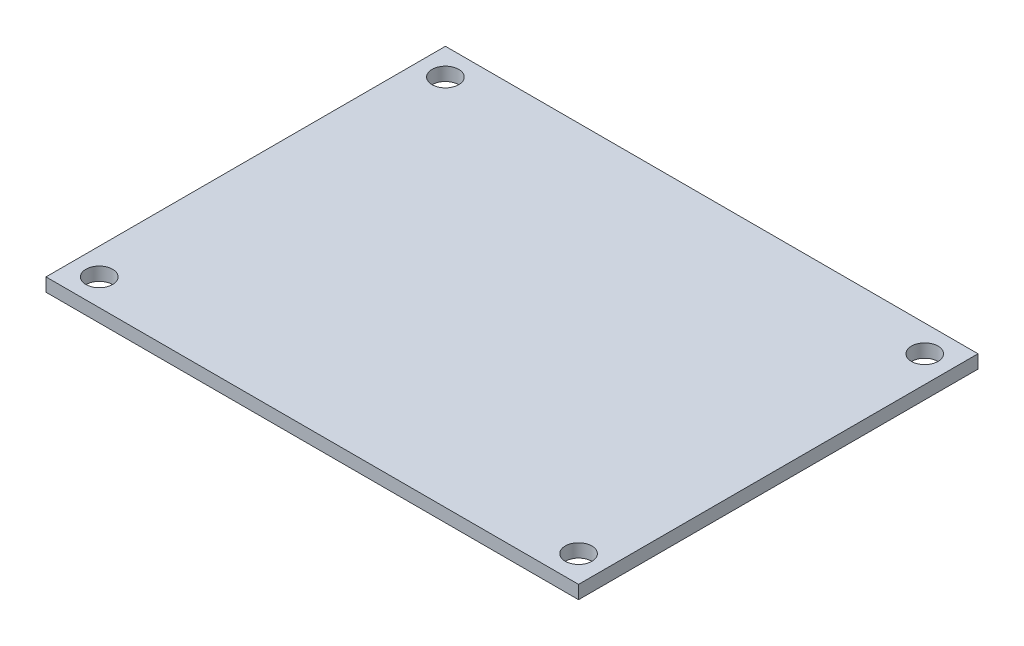
ISO-10303-21;
HEADER;
FILE_DESCRIPTION(('STEP AP214'),'2;1');
FILE_NAME('part.step','',(''),(''),'','','');
FILE_SCHEMA(('AUTOMOTIVE_DESIGN { 1 0 10303 214 1 1 1 1 }'));
ENDSEC;
DATA;
#1=APPLICATION_CONTEXT('core data for automotive mechanical design processes');
#2=APPLICATION_PROTOCOL_DEFINITION('international standard','automotive_design',2000,#1);
#3=PRODUCT_CONTEXT('',#1,'mechanical');
#4=PRODUCT('Part','Part','',(#3));
#5=PRODUCT_RELATED_PRODUCT_CATEGORY('part','',(#4));
#6=PRODUCT_DEFINITION_FORMATION('','',#4);
#7=PRODUCT_DEFINITION_CONTEXT('part definition',#1,'design');
#8=PRODUCT_DEFINITION('design','',#6,#7);
#9=PRODUCT_DEFINITION_SHAPE('','',#8);
#10=(LENGTH_UNIT() NAMED_UNIT(*) SI_UNIT(.MILLI.,.METRE.));
#11=(NAMED_UNIT(*) PLANE_ANGLE_UNIT() SI_UNIT($,.RADIAN.));
#12=(NAMED_UNIT(*) SI_UNIT($,.STERADIAN.) SOLID_ANGLE_UNIT());
#13=UNCERTAINTY_MEASURE_WITH_UNIT(LENGTH_MEASURE(1.E-05),#10,'distance_accuracy_value','');
#14=(GEOMETRIC_REPRESENTATION_CONTEXT(3) GLOBAL_UNCERTAINTY_ASSIGNED_CONTEXT((#13)) GLOBAL_UNIT_ASSIGNED_CONTEXT((#10,
#11,#12)) REPRESENTATION_CONTEXT('',''));
#15=CARTESIAN_POINT('',(0.,0.,0.));
#16=DIRECTION('',(0.,0.,1.));
#17=DIRECTION('',(1.,0.,0.));
#18=AXIS2_PLACEMENT_3D('',#15,#16,#17);
#19=CARTESIAN_POINT('',(30.,-0.75,-45.));
#20=DIRECTION('',(0.,0.,1.));
#21=DIRECTION('',(1.,0.,0.));
#22=AXIS2_PLACEMENT_3D('',#19,#20,#21);
#23=PLANE('',#22);
#24=DIRECTION('',(0.,1.,0.));
#25=VECTOR('',#24,1.);
#26=CARTESIAN_POINT('',(0.,-0.75,-45.));
#27=LINE('',#26,#25);
#28=CARTESIAN_POINT('',(0.,-1.5,-45.));
#29=VERTEX_POINT('',#28);
#30=CARTESIAN_POINT('',(0.,0.,-45.));
#31=VERTEX_POINT('',#30);
#32=EDGE_CURVE('E177',#29,#31,#27,.T.);
#33=ORIENTED_EDGE('',*,*,#32,.T.);
#34=DIRECTION('',(-1.,0.,0.));
#35=VECTOR('',#34,1.);
#36=CARTESIAN_POINT('',(30.,0.,-45.));
#37=LINE('',#36,#35);
#38=CARTESIAN_POINT('',(60.,0.,-45.));
#39=VERTEX_POINT('',#38);
#40=EDGE_CURVE('E142',#39,#31,#37,.T.);
#41=ORIENTED_EDGE('',*,*,#40,.F.);
#42=DIRECTION('',(0.,1.,0.));
#43=VECTOR('',#42,1.);
#44=CARTESIAN_POINT('',(60.,-0.75,-45.));
#45=LINE('',#44,#43);
#46=CARTESIAN_POINT('',(60.,-1.5,-45.));
#47=VERTEX_POINT('',#46);
#48=EDGE_CURVE('E11',#47,#39,#45,.T.);
#49=ORIENTED_EDGE('',*,*,#48,.F.);
#50=DIRECTION('',(1.,0.,0.));
#51=VECTOR('',#50,1.);
#52=CARTESIAN_POINT('',(30.,-1.5,-45.));
#53=LINE('',#52,#51);
#54=EDGE_CURVE('E130',#29,#47,#53,.T.);
#55=ORIENTED_EDGE('',*,*,#54,.F.);
#56=EDGE_LOOP('',(#33,#41,#49,#55));
#57=FACE_BOUND('',#56,.T.);
#58=ADVANCED_FACE('F16',(#57),#23,.F.);
#59=CARTESIAN_POINT('',(60.,-0.75,-22.5));
#60=DIRECTION('',(-1.,0.,0.));
#61=DIRECTION('',(0.,0.,1.));
#62=AXIS2_PLACEMENT_3D('',#59,#60,#61);
#63=PLANE('',#62);
#64=ORIENTED_EDGE('',*,*,#48,.T.);
#65=DIRECTION('',(0.,0.,-1.));
#66=VECTOR('',#65,1.);
#67=CARTESIAN_POINT('',(60.,0.,-22.5));
#68=LINE('',#67,#66);
#69=CARTESIAN_POINT('',(60.,0.,0.));
#70=VERTEX_POINT('',#69);
#71=EDGE_CURVE('E188',#70,#39,#68,.T.);
#72=ORIENTED_EDGE('',*,*,#71,.F.);
#73=DIRECTION('',(0.,1.,0.));
#74=VECTOR('',#73,1.);
#75=CARTESIAN_POINT('',(60.,-0.75,0.));
#76=LINE('',#75,#74);
#77=CARTESIAN_POINT('',(60.,-1.5,0.));
#78=VERTEX_POINT('',#77);
#79=EDGE_CURVE('E27',#78,#70,#76,.T.);
#80=ORIENTED_EDGE('',*,*,#79,.F.);
#81=DIRECTION('',(0.,0.,1.));
#82=VECTOR('',#81,1.);
#83=CARTESIAN_POINT('',(60.,-1.5,-22.5));
#84=LINE('',#83,#82);
#85=EDGE_CURVE('E167',#47,#78,#84,.T.);
#86=ORIENTED_EDGE('',*,*,#85,.F.);
#87=EDGE_LOOP('',(#64,#72,#80,#86));
#88=FACE_BOUND('',#87,.T.);
#89=ADVANCED_FACE('F18',(#88),#63,.F.);
#90=CARTESIAN_POINT('',(30.,-0.75,0.));
#91=DIRECTION('',(0.,0.,-1.));
#92=DIRECTION('',(0.,-1.,0.));
#93=AXIS2_PLACEMENT_3D('',#90,#91,#92);
#94=PLANE('',#93);
#95=ORIENTED_EDGE('',*,*,#79,.T.);
#96=DIRECTION('',(1.,0.,0.));
#97=VECTOR('',#96,1.);
#98=CARTESIAN_POINT('',(30.,0.,0.));
#99=LINE('',#98,#97);
#100=CARTESIAN_POINT('',(0.,0.,0.));
#101=VERTEX_POINT('',#100);
#102=EDGE_CURVE('E141',#101,#70,#99,.T.);
#103=ORIENTED_EDGE('',*,*,#102,.F.);
#104=DIRECTION('',(0.,1.,0.));
#105=VECTOR('',#104,1.);
#106=CARTESIAN_POINT('',(0.,-0.75,0.));
#107=LINE('',#106,#105);
#108=CARTESIAN_POINT('',(0.,-1.5,0.));
#109=VERTEX_POINT('',#108);
#110=EDGE_CURVE('E165',#109,#101,#107,.T.);
#111=ORIENTED_EDGE('',*,*,#110,.F.);
#112=DIRECTION('',(-1.,0.,0.));
#113=VECTOR('',#112,1.);
#114=CARTESIAN_POINT('',(30.,-1.5,0.));
#115=LINE('',#114,#113);
#116=EDGE_CURVE('E171',#78,#109,#115,.T.);
#117=ORIENTED_EDGE('',*,*,#116,.F.);
#118=EDGE_LOOP('',(#95,#103,#111,#117));
#119=FACE_BOUND('',#118,.T.);
#120=ADVANCED_FACE('F297',(#119),#94,.F.);
#121=CARTESIAN_POINT('',(0.,-0.75,-22.5));
#122=DIRECTION('',(1.,0.,0.));
#123=DIRECTION('',(0.,1.,0.));
#124=AXIS2_PLACEMENT_3D('',#121,#122,#123);
#125=PLANE('',#124);
#126=ORIENTED_EDGE('',*,*,#110,.T.);
#127=DIRECTION('',(0.,0.,1.));
#128=VECTOR('',#127,1.);
#129=CARTESIAN_POINT('',(0.,0.,-22.5));
#130=LINE('',#129,#128);
#131=EDGE_CURVE('E137',#31,#101,#130,.T.);
#132=ORIENTED_EDGE('',*,*,#131,.F.);
#133=ORIENTED_EDGE('',*,*,#32,.F.);
#134=DIRECTION('',(0.,0.,-1.));
#135=VECTOR('',#134,1.);
#136=CARTESIAN_POINT('',(0.,-1.5,-22.5));
#137=LINE('',#136,#135);
#138=EDGE_CURVE('E20',#109,#29,#137,.T.);
#139=ORIENTED_EDGE('',*,*,#138,.F.);
#140=EDGE_LOOP('',(#126,#132,#133,#139));
#141=FACE_BOUND('',#140,.T.);
#142=ADVANCED_FACE('F288',(#141),#125,.F.);
#143=CARTESIAN_POINT('',(30.,0.,-22.5));
#144=DIRECTION('',(0.,-1.,0.));
#145=DIRECTION('',(0.,0.,-1.));
#146=AXIS2_PLACEMENT_3D('',#143,#144,#145);
#147=PLANE('',#146);
#148=CARTESIAN_POINT('',(57.,0.,-3.));
#149=DIRECTION('',(0.,-1.,0.));
#150=DIRECTION('',(1.,0.,0.));
#151=AXIS2_PLACEMENT_3D('',#148,#149,#150);
#152=CIRCLE('',#151,1.5);
#153=CARTESIAN_POINT('',(55.5,0.,-3.));
#154=VERTEX_POINT('',#153);
#155=EDGE_CURVE('E110',#154,#154,#152,.T.);
#156=ORIENTED_EDGE('',*,*,#155,.T.);
#157=EDGE_LOOP('',(#156));
#158=FACE_BOUND('',#157,.T.);
#159=CARTESIAN_POINT('',(57.,0.,-42.));
#160=DIRECTION('',(0.,-1.,0.));
#161=DIRECTION('',(-1.,0.,0.));
#162=AXIS2_PLACEMENT_3D('',#159,#160,#161);
#163=CIRCLE('',#162,1.5);
#164=CARTESIAN_POINT('',(58.5,0.,-42.));
#165=VERTEX_POINT('',#164);
#166=EDGE_CURVE('E99',#165,#165,#163,.T.);
#167=ORIENTED_EDGE('',*,*,#166,.T.);
#168=EDGE_LOOP('',(#167));
#169=FACE_BOUND('',#168,.T.);
#170=CARTESIAN_POINT('',(3.,0.,-42.));
#171=DIRECTION('',(0.,-1.,0.));
#172=DIRECTION('',(-1.,0.,0.));
#173=AXIS2_PLACEMENT_3D('',#170,#171,#172);
#174=CIRCLE('',#173,1.5);
#175=CARTESIAN_POINT('',(4.5,0.,-42.));
#176=VERTEX_POINT('',#175);
#177=EDGE_CURVE('E181',#176,#176,#174,.T.);
#178=ORIENTED_EDGE('',*,*,#177,.T.);
#179=EDGE_LOOP('',(#178));
#180=FACE_BOUND('',#179,.T.);
#181=CARTESIAN_POINT('',(3.,0.,-3.));
#182=DIRECTION('',(0.,-1.,0.));
#183=DIRECTION('',(1.,0.,0.));
#184=AXIS2_PLACEMENT_3D('',#181,#182,#183);
#185=CIRCLE('',#184,1.5);
#186=CARTESIAN_POINT('',(1.5,0.,-3.));
#187=VERTEX_POINT('',#186);
#188=EDGE_CURVE('E136',#187,#187,#185,.T.);
#189=ORIENTED_EDGE('',*,*,#188,.T.);
#190=EDGE_LOOP('',(#189));
#191=FACE_BOUND('',#190,.T.);
#192=ORIENTED_EDGE('',*,*,#40,.T.);
#193=ORIENTED_EDGE('',*,*,#131,.T.);
#194=ORIENTED_EDGE('',*,*,#102,.T.);
#195=ORIENTED_EDGE('',*,*,#71,.T.);
#196=EDGE_LOOP('',(#192,#193,#194,#195));
#197=FACE_BOUND('',#196,.T.);
#198=ADVANCED_FACE('F279',(#158,#169,#180,#191,#197),#147,.F.);
#199=CARTESIAN_POINT('',(30.,-1.5,-22.5));
#200=DIRECTION('',(0.,-1.,0.));
#201=DIRECTION('',(0.,0.,-1.));
#202=AXIS2_PLACEMENT_3D('',#199,#200,#201);
#203=PLANE('',#202);
#204=CARTESIAN_POINT('',(57.,-1.5,-3.));
#205=DIRECTION('',(0.,1.,0.));
#206=DIRECTION('',(1.,0.,0.));
#207=AXIS2_PLACEMENT_3D('',#204,#205,#206);
#208=CIRCLE('',#207,1.5);
#209=CARTESIAN_POINT('',(55.5,-1.5,-3.));
#210=VERTEX_POINT('',#209);
#211=EDGE_CURVE('E109',#210,#210,#208,.T.);
#212=ORIENTED_EDGE('',*,*,#211,.T.);
#213=EDGE_LOOP('',(#212));
#214=FACE_BOUND('',#213,.T.);
#215=CARTESIAN_POINT('',(57.,-1.5,-42.));
#216=DIRECTION('',(0.,1.,0.));
#217=DIRECTION('',(-1.,0.,0.));
#218=AXIS2_PLACEMENT_3D('',#215,#216,#217);
#219=CIRCLE('',#218,1.5);
#220=CARTESIAN_POINT('',(58.5,-1.5,-42.));
#221=VERTEX_POINT('',#220);
#222=EDGE_CURVE('E126',#221,#221,#219,.T.);
#223=ORIENTED_EDGE('',*,*,#222,.T.);
#224=EDGE_LOOP('',(#223));
#225=FACE_BOUND('',#224,.T.);
#226=CARTESIAN_POINT('',(3.,-1.5,-42.));
#227=DIRECTION('',(0.,1.,0.));
#228=DIRECTION('',(-1.,0.,0.));
#229=AXIS2_PLACEMENT_3D('',#226,#227,#228);
#230=CIRCLE('',#229,1.5);
#231=CARTESIAN_POINT('',(4.5,-1.5,-42.));
#232=VERTEX_POINT('',#231);
#233=EDGE_CURVE('E131',#232,#232,#230,.T.);
#234=ORIENTED_EDGE('',*,*,#233,.T.);
#235=EDGE_LOOP('',(#234));
#236=FACE_BOUND('',#235,.T.);
#237=CARTESIAN_POINT('',(3.,-1.5,-3.));
#238=DIRECTION('',(0.,1.,0.));
#239=DIRECTION('',(1.,0.,0.));
#240=AXIS2_PLACEMENT_3D('',#237,#238,#239);
#241=CIRCLE('',#240,1.5);
#242=CARTESIAN_POINT('',(1.5,-1.5,-3.));
#243=VERTEX_POINT('',#242);
#244=EDGE_CURVE('E154',#243,#243,#241,.T.);
#245=ORIENTED_EDGE('',*,*,#244,.T.);
#246=EDGE_LOOP('',(#245));
#247=FACE_BOUND('',#246,.T.);
#248=ORIENTED_EDGE('',*,*,#54,.T.);
#249=ORIENTED_EDGE('',*,*,#85,.T.);
#250=ORIENTED_EDGE('',*,*,#116,.T.);
#251=ORIENTED_EDGE('',*,*,#138,.T.);
#252=EDGE_LOOP('',(#248,#249,#250,#251));
#253=FACE_BOUND('',#252,.T.);
#254=ADVANCED_FACE('F114',(#214,#225,#236,#247,#253),#203,.T.);
#255=CARTESIAN_POINT('',(57.,-1.5,-3.));
#256=DIRECTION('',(0.,1.,0.));
#257=DIRECTION('',(1.,0.,0.));
#258=AXIS2_PLACEMENT_3D('',#255,#256,#257);
#259=CYLINDRICAL_SURFACE('',#258,1.5);
#260=ORIENTED_EDGE('',*,*,#211,.F.);
#261=DIRECTION('',(0.,1.,0.));
#262=VECTOR('',#261,1.);
#263=CARTESIAN_POINT('',(55.5,-1.5,-3.));
#264=LINE('',#263,#262);
#265=EDGE_CURVE('E106',#210,#154,#264,.T.);
#266=ORIENTED_EDGE('',*,*,#265,.T.);
#267=ORIENTED_EDGE('',*,*,#155,.F.);
#268=ORIENTED_EDGE('',*,*,#265,.F.);
#269=EDGE_LOOP('',(#260,#266,#267,#268));
#270=FACE_BOUND('',#269,.T.);
#271=ADVANCED_FACE('F108',(#270),#259,.F.);
#272=CARTESIAN_POINT('',(57.,-1.5,-42.));
#273=DIRECTION('',(0.,1.,0.));
#274=DIRECTION('',(-1.,0.,0.));
#275=AXIS2_PLACEMENT_3D('',#272,#273,#274);
#276=CYLINDRICAL_SURFACE('',#275,1.5);
#277=ORIENTED_EDGE('',*,*,#222,.F.);
#278=DIRECTION('',(0.,1.,0.));
#279=VECTOR('',#278,1.);
#280=CARTESIAN_POINT('',(58.5,-1.5,-42.));
#281=LINE('',#280,#279);
#282=EDGE_CURVE('E122',#221,#165,#281,.T.);
#283=ORIENTED_EDGE('',*,*,#282,.T.);
#284=ORIENTED_EDGE('',*,*,#166,.F.);
#285=ORIENTED_EDGE('',*,*,#282,.F.);
#286=EDGE_LOOP('',(#277,#283,#284,#285));
#287=FACE_BOUND('',#286,.T.);
#288=ADVANCED_FACE('F305',(#287),#276,.F.);
#289=CARTESIAN_POINT('',(3.,-1.5,-42.));
#290=DIRECTION('',(0.,1.,0.));
#291=DIRECTION('',(-1.,0.,0.));
#292=AXIS2_PLACEMENT_3D('',#289,#290,#291);
#293=CYLINDRICAL_SURFACE('',#292,1.5);
#294=ORIENTED_EDGE('',*,*,#233,.F.);
#295=DIRECTION('',(0.,1.,0.));
#296=VECTOR('',#295,1.);
#297=CARTESIAN_POINT('',(4.5,-1.5,-42.));
#298=LINE('',#297,#296);
#299=EDGE_CURVE('E135',#232,#176,#298,.T.);
#300=ORIENTED_EDGE('',*,*,#299,.T.);
#301=ORIENTED_EDGE('',*,*,#177,.F.);
#302=ORIENTED_EDGE('',*,*,#299,.F.);
#303=EDGE_LOOP('',(#294,#300,#301,#302));
#304=FACE_BOUND('',#303,.T.);
#305=ADVANCED_FACE('F270',(#304),#293,.F.);
#306=CARTESIAN_POINT('',(3.,-1.5,-3.));
#307=DIRECTION('',(0.,1.,0.));
#308=DIRECTION('',(1.,0.,0.));
#309=AXIS2_PLACEMENT_3D('',#306,#307,#308);
#310=CYLINDRICAL_SURFACE('',#309,1.5);
#311=ORIENTED_EDGE('',*,*,#244,.F.);
#312=DIRECTION('',(0.,1.,0.));
#313=VECTOR('',#312,1.);
#314=CARTESIAN_POINT('',(1.5,-1.5,-3.));
#315=LINE('',#314,#313);
#316=EDGE_CURVE('E147',#243,#187,#315,.T.);
#317=ORIENTED_EDGE('',*,*,#316,.T.);
#318=ORIENTED_EDGE('',*,*,#188,.F.);
#319=ORIENTED_EDGE('',*,*,#316,.F.);
#320=EDGE_LOOP('',(#311,#317,#318,#319));
#321=FACE_BOUND('',#320,.T.);
#322=ADVANCED_FACE('F266',(#321),#310,.F.);
#323=CLOSED_SHELL('',(#58,#89,#120,#142,#198,#254,#271,#288,#305,#322));
#324=MANIFOLD_SOLID_BREP('B1',#323);
#325=ADVANCED_BREP_SHAPE_REPRESENTATION('',(#18,#324),#14);
#326=SHAPE_DEFINITION_REPRESENTATION(#9,#325);
ENDSEC;
END-ISO-10303-21;
